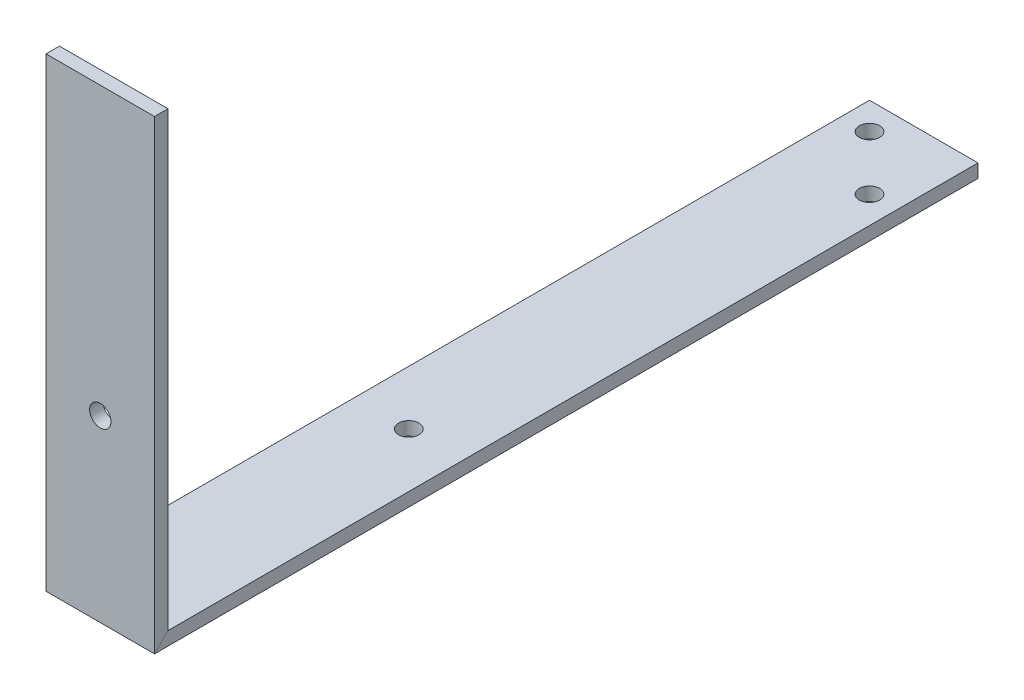
ISO-10303-21;
HEADER;
FILE_DESCRIPTION(('STEP AP214'),'2;1');
FILE_NAME('part.step','',(''),(''),'','','');
FILE_SCHEMA(('AUTOMOTIVE_DESIGN { 1 0 10303 214 1 1 1 1 }'));
ENDSEC;
DATA;
#1=APPLICATION_CONTEXT('core data for automotive mechanical design processes');
#2=APPLICATION_PROTOCOL_DEFINITION('international standard','automotive_design',2000,#1);
#3=PRODUCT_CONTEXT('',#1,'mechanical');
#4=PRODUCT('Part','Part','',(#3));
#5=PRODUCT_RELATED_PRODUCT_CATEGORY('part','',(#4));
#6=PRODUCT_DEFINITION_FORMATION('','',#4);
#7=PRODUCT_DEFINITION_CONTEXT('part definition',#1,'design');
#8=PRODUCT_DEFINITION('design','',#6,#7);
#9=PRODUCT_DEFINITION_SHAPE('','',#8);
#10=(LENGTH_UNIT() NAMED_UNIT(*) SI_UNIT(.MILLI.,.METRE.));
#11=(NAMED_UNIT(*) PLANE_ANGLE_UNIT() SI_UNIT($,.RADIAN.));
#12=(NAMED_UNIT(*) SI_UNIT($,.STERADIAN.) SOLID_ANGLE_UNIT());
#13=UNCERTAINTY_MEASURE_WITH_UNIT(LENGTH_MEASURE(1.E-05),#10,'distance_accuracy_value','');
#14=(GEOMETRIC_REPRESENTATION_CONTEXT(3) GLOBAL_UNCERTAINTY_ASSIGNED_CONTEXT((#13)) GLOBAL_UNIT_ASSIGNED_CONTEXT((#10,
#11,#12)) REPRESENTATION_CONTEXT('',''));
#15=CARTESIAN_POINT('',(0.,0.,0.));
#16=DIRECTION('',(0.,0.,1.));
#17=DIRECTION('',(1.,0.,0.));
#18=AXIS2_PLACEMENT_3D('',#15,#16,#17);
#19=CARTESIAN_POINT('',(1761.3,-570.395,308.16));
#20=DIRECTION('',(0.,1.,0.));
#21=DIRECTION('',(0.,0.,1.));
#22=AXIS2_PLACEMENT_3D('',#19,#20,#21);
#23=PLANE('',#22);
#24=CARTESIAN_POINT('',(1773.99999999906,-570.395,323.462204665884));
#25=DIRECTION('',(0.,-1.,0.));
#26=DIRECTION('',(0.,0.,-1.));
#27=AXIS2_PLACEMENT_3D('',#24,#25,#26);
#28=CIRCLE('',#27,4.76250000000013);
#29=CARTESIAN_POINT('',(1773.99999999906,-570.395,318.699704665884));
#30=VERTEX_POINT('',#29);
#31=EDGE_CURVE('E122',#30,#30,#28,.T.);
#32=ORIENTED_EDGE('',*,*,#31,.F.);
#33=EDGE_LOOP('',(#32));
#34=FACE_BOUND('',#33,.T.);
#35=CARTESIAN_POINT('',(1799.39999999906,-570.395,348.862204665884));
#36=DIRECTION('',(0.,-1.,0.));
#37=DIRECTION('',(0.,0.,-1.));
#38=AXIS2_PLACEMENT_3D('',#35,#36,#37);
#39=CIRCLE('',#38,4.76250000000011);
#40=CARTESIAN_POINT('',(1799.39999999906,-570.395,344.099704665884));
#41=VERTEX_POINT('',#40);
#42=EDGE_CURVE('E125',#41,#41,#39,.T.);
#43=ORIENTED_EDGE('',*,*,#42,.F.);
#44=EDGE_LOOP('',(#43));
#45=FACE_BOUND('',#44,.T.);
#46=CARTESIAN_POINT('',(1786.7,-570.395,551.855));
#47=DIRECTION('',(0.,1.,0.));
#48=DIRECTION('',(0.,0.,1.));
#49=AXIS2_PLACEMENT_3D('',#46,#47,#48);
#50=CIRCLE('',#49,4.76249999999992);
#51=CARTESIAN_POINT('',(1786.7,-570.395,556.6175));
#52=VERTEX_POINT('',#51);
#53=EDGE_CURVE('E138',#52,#52,#50,.T.);
#54=ORIENTED_EDGE('',*,*,#53,.T.);
#55=EDGE_LOOP('',(#54));
#56=FACE_BOUND('',#55,.T.);
#57=DIRECTION('',(-1.,0.,0.));
#58=VECTOR('',#57,1.);
#59=CARTESIAN_POINT('',(1812.1,-570.395,310.76));
#60=LINE('',#59,#58);
#61=CARTESIAN_POINT('',(1812.1,-570.395,310.76));
#62=VERTEX_POINT('',#61);
#63=CARTESIAN_POINT('',(1761.3,-570.395,310.76));
#64=VERTEX_POINT('',#63);
#65=EDGE_CURVE('E52',#62,#64,#60,.T.);
#66=ORIENTED_EDGE('',*,*,#65,.F.);
#67=DIRECTION('',(0.,0.,1.));
#68=VECTOR('',#67,1.);
#69=CARTESIAN_POINT('',(1812.1,-570.395,308.16));
#70=LINE('',#69,#68);
#71=CARTESIAN_POINT('',(1812.1,-570.395,696.315));
#72=VERTEX_POINT('',#71);
#73=EDGE_CURVE('E150',#62,#72,#70,.T.);
#74=ORIENTED_EDGE('',*,*,#73,.T.);
#75=DIRECTION('',(1.,0.,0.));
#76=VECTOR('',#75,1.);
#77=CARTESIAN_POINT('',(1761.3,-570.395,696.315));
#78=LINE('',#77,#76);
#79=CARTESIAN_POINT('',(1761.3,-570.395,696.315));
#80=VERTEX_POINT('',#79);
#81=EDGE_CURVE('E99',#80,#72,#78,.T.);
#82=ORIENTED_EDGE('',*,*,#81,.F.);
#83=DIRECTION('',(0.,0.,1.));
#84=VECTOR('',#83,1.);
#85=CARTESIAN_POINT('',(1761.3,-570.395,308.16));
#86=LINE('',#85,#84);
#87=EDGE_CURVE('E156',#64,#80,#86,.T.);
#88=ORIENTED_EDGE('',*,*,#87,.F.);
#89=EDGE_LOOP('',(#66,#74,#82,#88));
#90=FACE_BOUND('',#89,.T.);
#91=ADVANCED_FACE('F35',(#34,#45,#56,#90),#23,.F.);
#92=CARTESIAN_POINT('',(1812.1,-570.395,308.16));
#93=DIRECTION('',(-1.,0.,0.));
#94=DIRECTION('',(0.,0.,1.));
#95=AXIS2_PLACEMENT_3D('',#92,#93,#94);
#96=PLANE('',#95);
#97=DIRECTION('',(0.,-1.,0.));
#98=VECTOR('',#97,1.);
#99=CARTESIAN_POINT('',(1812.1,-564.085,310.76));
#100=LINE('',#99,#98);
#101=CARTESIAN_POINT('',(1812.1,-564.085,310.76));
#102=VERTEX_POINT('',#101);
#103=EDGE_CURVE('E143',#102,#62,#100,.T.);
#104=ORIENTED_EDGE('',*,*,#103,.F.);
#105=DIRECTION('',(0.,0.,1.));
#106=VECTOR('',#105,1.);
#107=CARTESIAN_POINT('',(1812.1,-564.085,308.16));
#108=LINE('',#107,#106);
#109=CARTESIAN_POINT('',(1812.1,-564.085,690.005));
#110=VERTEX_POINT('',#109);
#111=EDGE_CURVE('E60',#102,#110,#108,.T.);
#112=ORIENTED_EDGE('',*,*,#111,.T.);
#113=DIRECTION('',(0.,0.707106781186548,-0.707106781186548));
#114=VECTOR('',#113,1.);
#115=CARTESIAN_POINT('',(1812.1,-376.3175,502.2375));
#116=LINE('',#115,#114);
#117=EDGE_CURVE('E44',#72,#110,#116,.T.);
#118=ORIENTED_EDGE('',*,*,#117,.F.);
#119=ORIENTED_EDGE('',*,*,#73,.F.);
#120=EDGE_LOOP('',(#104,#112,#118,#119));
#121=FACE_BOUND('',#120,.T.);
#122=ADVANCED_FACE('F185',(#121),#96,.F.);
#123=CARTESIAN_POINT('',(1761.3,-564.085,308.16));
#124=DIRECTION('',(0.,-1.,0.));
#125=DIRECTION('',(0.,0.,-1.));
#126=AXIS2_PLACEMENT_3D('',#123,#124,#125);
#127=PLANE('',#126);
#128=CARTESIAN_POINT('',(1773.99999999906,-564.085,323.462204665884));
#129=DIRECTION('',(0.,-1.,0.));
#130=DIRECTION('',(0.,0.,-1.));
#131=AXIS2_PLACEMENT_3D('',#128,#129,#130);
#132=CIRCLE('',#131,4.76250000000013);
#133=CARTESIAN_POINT('',(1773.99999999906,-564.085,318.699704665884));
#134=VERTEX_POINT('',#133);
#135=EDGE_CURVE('E39',#134,#134,#132,.T.);
#136=ORIENTED_EDGE('',*,*,#135,.T.);
#137=EDGE_LOOP('',(#136));
#138=FACE_BOUND('',#137,.T.);
#139=CARTESIAN_POINT('',(1799.39999999906,-564.085,348.862204665884));
#140=DIRECTION('',(0.,-1.,0.));
#141=DIRECTION('',(0.,0.,-1.));
#142=AXIS2_PLACEMENT_3D('',#139,#140,#141);
#143=CIRCLE('',#142,4.76250000000011);
#144=CARTESIAN_POINT('',(1799.39999999906,-564.085,344.099704665884));
#145=VERTEX_POINT('',#144);
#146=EDGE_CURVE('E128',#145,#145,#143,.T.);
#147=ORIENTED_EDGE('',*,*,#146,.T.);
#148=EDGE_LOOP('',(#147));
#149=FACE_BOUND('',#148,.T.);
#150=CARTESIAN_POINT('',(1786.7,-564.085,551.855));
#151=DIRECTION('',(0.,1.,0.));
#152=DIRECTION('',(0.,0.,1.));
#153=AXIS2_PLACEMENT_3D('',#150,#151,#152);
#154=CIRCLE('',#153,4.76249999999992);
#155=CARTESIAN_POINT('',(1786.7,-564.085,556.6175));
#156=VERTEX_POINT('',#155);
#157=EDGE_CURVE('E135',#156,#156,#154,.T.);
#158=ORIENTED_EDGE('',*,*,#157,.F.);
#159=EDGE_LOOP('',(#158));
#160=FACE_BOUND('',#159,.T.);
#161=DIRECTION('',(1.,0.,0.));
#162=VECTOR('',#161,1.);
#163=CARTESIAN_POINT('',(1761.3,-564.085,310.76));
#164=LINE('',#163,#162);
#165=CARTESIAN_POINT('',(1761.3,-564.085,310.76));
#166=VERTEX_POINT('',#165);
#167=EDGE_CURVE('E141',#166,#102,#164,.T.);
#168=ORIENTED_EDGE('',*,*,#167,.F.);
#169=DIRECTION('',(0.,0.,1.));
#170=VECTOR('',#169,1.);
#171=CARTESIAN_POINT('',(1761.3,-564.085,308.16));
#172=LINE('',#171,#170);
#173=CARTESIAN_POINT('',(1761.3,-564.085,690.005));
#174=VERTEX_POINT('',#173);
#175=EDGE_CURVE('E154',#166,#174,#172,.T.);
#176=ORIENTED_EDGE('',*,*,#175,.T.);
#177=DIRECTION('',(-1.,0.,0.));
#178=VECTOR('',#177,1.);
#179=CARTESIAN_POINT('',(1761.3,-564.085,690.005));
#180=LINE('',#179,#178);
#181=EDGE_CURVE('E11',#110,#174,#180,.T.);
#182=ORIENTED_EDGE('',*,*,#181,.F.);
#183=ORIENTED_EDGE('',*,*,#111,.F.);
#184=EDGE_LOOP('',(#168,#176,#182,#183));
#185=FACE_BOUND('',#184,.T.);
#186=ADVANCED_FACE('F166',(#138,#149,#160,#185),#127,.F.);
#187=CARTESIAN_POINT('',(1761.3,-570.395,308.16));
#188=DIRECTION('',(1.,0.,0.));
#189=DIRECTION('',(0.,0.,-1.));
#190=AXIS2_PLACEMENT_3D('',#187,#188,#189);
#191=PLANE('',#190);
#192=DIRECTION('',(0.,1.,0.));
#193=VECTOR('',#192,1.);
#194=CARTESIAN_POINT('',(1761.3,-570.395,310.76));
#195=LINE('',#194,#193);
#196=EDGE_CURVE('E103',#64,#166,#195,.T.);
#197=ORIENTED_EDGE('',*,*,#196,.F.);
#198=ORIENTED_EDGE('',*,*,#87,.T.);
#199=DIRECTION('',(0.,-0.707106781186548,0.707106781186548));
#200=VECTOR('',#199,1.);
#201=CARTESIAN_POINT('',(1761.3,-376.3175,502.2375));
#202=LINE('',#201,#200);
#203=EDGE_CURVE('E149',#174,#80,#202,.T.);
#204=ORIENTED_EDGE('',*,*,#203,.F.);
#205=ORIENTED_EDGE('',*,*,#175,.F.);
#206=EDGE_LOOP('',(#197,#198,#204,#205));
#207=FACE_BOUND('',#206,.T.);
#208=ADVANCED_FACE('F208',(#207),#191,.F.);
#209=CARTESIAN_POINT('',(1761.3,-570.8105,696.315));
#210=DIRECTION('',(0.,0.,-1.));
#211=DIRECTION('',(-1.,0.,0.));
#212=AXIS2_PLACEMENT_3D('',#209,#210,#211);
#213=PLANE('',#212);
#214=CARTESIAN_POINT('',(1786.70000007806,-486.498712740003,696.315));
#215=DIRECTION('',(0.,0.,-1.));
#216=DIRECTION('',(-1.,0.,0.));
#217=AXIS2_PLACEMENT_3D('',#214,#215,#216);
#218=CIRCLE('',#217,5.00000002243565);
#219=CARTESIAN_POINT('',(1781.70000005563,-486.498712740003,696.315));
#220=VERTEX_POINT('',#219);
#221=EDGE_CURVE('E132',#220,#220,#218,.T.);
#222=ORIENTED_EDGE('',*,*,#221,.T.);
#223=EDGE_LOOP('',(#222));
#224=FACE_BOUND('',#223,.T.);
#225=DIRECTION('',(0.,1.,0.));
#226=VECTOR('',#225,1.);
#227=CARTESIAN_POINT('',(1812.1,-570.8105,696.315));
#228=LINE('',#227,#226);
#229=CARTESIAN_POINT('',(1812.1,-352.495,696.315));
#230=VERTEX_POINT('',#229);
#231=EDGE_CURVE('E93',#72,#230,#228,.T.);
#232=ORIENTED_EDGE('',*,*,#231,.T.);
#233=DIRECTION('',(1.,0.,0.));
#234=VECTOR('',#233,1.);
#235=CARTESIAN_POINT('',(1812.1,-352.495,696.315));
#236=LINE('',#235,#234);
#237=CARTESIAN_POINT('',(1761.3,-352.495,696.315));
#238=VERTEX_POINT('',#237);
#239=EDGE_CURVE('E97',#238,#230,#236,.T.);
#240=ORIENTED_EDGE('',*,*,#239,.F.);
#241=DIRECTION('',(0.,1.,0.));
#242=VECTOR('',#241,1.);
#243=CARTESIAN_POINT('',(1761.3,-570.8105,696.315));
#244=LINE('',#243,#242);
#245=EDGE_CURVE('E152',#80,#238,#244,.T.);
#246=ORIENTED_EDGE('',*,*,#245,.F.);
#247=ORIENTED_EDGE('',*,*,#81,.T.);
#248=EDGE_LOOP('',(#232,#240,#246,#247));
#249=FACE_BOUND('',#248,.T.);
#250=ADVANCED_FACE('F37',(#224,#249),#213,.F.);
#251=CARTESIAN_POINT('',(1812.1,-570.8105,696.315));
#252=DIRECTION('',(-1.,0.,0.));
#253=DIRECTION('',(0.,0.,1.));
#254=AXIS2_PLACEMENT_3D('',#251,#252,#253);
#255=PLANE('',#254);
#256=DIRECTION('',(0.,1.,0.));
#257=VECTOR('',#256,1.);
#258=CARTESIAN_POINT('',(1812.1,-570.8105,690.005));
#259=LINE('',#258,#257);
#260=CARTESIAN_POINT('',(1812.1,-352.495,690.005));
#261=VERTEX_POINT('',#260);
#262=EDGE_CURVE('E102',#110,#261,#259,.T.);
#263=ORIENTED_EDGE('',*,*,#262,.T.);
#264=DIRECTION('',(0.,0.,-1.));
#265=VECTOR('',#264,1.);
#266=CARTESIAN_POINT('',(1812.1,-352.495,690.005));
#267=LINE('',#266,#265);
#268=EDGE_CURVE('E106',#230,#261,#267,.T.);
#269=ORIENTED_EDGE('',*,*,#268,.F.);
#270=ORIENTED_EDGE('',*,*,#231,.F.);
#271=ORIENTED_EDGE('',*,*,#117,.T.);
#272=EDGE_LOOP('',(#263,#269,#270,#271));
#273=FACE_BOUND('',#272,.T.);
#274=ADVANCED_FACE('F107',(#273),#255,.F.);
#275=CARTESIAN_POINT('',(1761.3,-570.8105,690.005));
#276=DIRECTION('',(0.,0.,1.));
#277=DIRECTION('',(1.,0.,0.));
#278=AXIS2_PLACEMENT_3D('',#275,#276,#277);
#279=PLANE('',#278);
#280=CARTESIAN_POINT('',(1786.70000007806,-486.498712740003,690.005));
#281=DIRECTION('',(0.,0.,-1.));
#282=DIRECTION('',(-1.,0.,0.));
#283=AXIS2_PLACEMENT_3D('',#280,#281,#282);
#284=CIRCLE('',#283,5.00000002243565);
#285=CARTESIAN_POINT('',(1781.70000005563,-486.498712740003,690.005));
#286=VERTEX_POINT('',#285);
#287=EDGE_CURVE('E129',#286,#286,#284,.T.);
#288=ORIENTED_EDGE('',*,*,#287,.F.);
#289=EDGE_LOOP('',(#288));
#290=FACE_BOUND('',#289,.T.);
#291=DIRECTION('',(0.,1.,0.));
#292=VECTOR('',#291,1.);
#293=CARTESIAN_POINT('',(1761.3,-570.8105,690.005));
#294=LINE('',#293,#292);
#295=CARTESIAN_POINT('',(1761.3,-352.495,690.005));
#296=VERTEX_POINT('',#295);
#297=EDGE_CURVE('E161',#174,#296,#294,.T.);
#298=ORIENTED_EDGE('',*,*,#297,.T.);
#299=DIRECTION('',(-1.,0.,0.));
#300=VECTOR('',#299,1.);
#301=CARTESIAN_POINT('',(1761.3,-352.495,690.005));
#302=LINE('',#301,#300);
#303=EDGE_CURVE('E112',#261,#296,#302,.T.);
#304=ORIENTED_EDGE('',*,*,#303,.F.);
#305=ORIENTED_EDGE('',*,*,#262,.F.);
#306=ORIENTED_EDGE('',*,*,#181,.T.);
#307=EDGE_LOOP('',(#298,#304,#305,#306));
#308=FACE_BOUND('',#307,.T.);
#309=ADVANCED_FACE('F200',(#290,#308),#279,.F.);
#310=CARTESIAN_POINT('',(1761.3,-570.8105,696.315));
#311=DIRECTION('',(1.,0.,0.));
#312=DIRECTION('',(0.,0.,-1.));
#313=AXIS2_PLACEMENT_3D('',#310,#311,#312);
#314=PLANE('',#313);
#315=ORIENTED_EDGE('',*,*,#245,.T.);
#316=DIRECTION('',(0.,0.,1.));
#317=VECTOR('',#316,1.);
#318=CARTESIAN_POINT('',(1761.3,-352.495,696.315));
#319=LINE('',#318,#317);
#320=EDGE_CURVE('E117',#296,#238,#319,.T.);
#321=ORIENTED_EDGE('',*,*,#320,.F.);
#322=ORIENTED_EDGE('',*,*,#297,.F.);
#323=ORIENTED_EDGE('',*,*,#203,.T.);
#324=EDGE_LOOP('',(#315,#321,#322,#323));
#325=FACE_BOUND('',#324,.T.);
#326=ADVANCED_FACE('F196',(#325),#314,.F.);
#327=CARTESIAN_POINT('',(0.,0.,310.76));
#328=DIRECTION('',(0.,0.,-1.));
#329=DIRECTION('',(-1.,0.,0.));
#330=AXIS2_PLACEMENT_3D('',#327,#328,#329);
#331=PLANE('',#330);
#332=ORIENTED_EDGE('',*,*,#167,.T.);
#333=ORIENTED_EDGE('',*,*,#103,.T.);
#334=ORIENTED_EDGE('',*,*,#65,.T.);
#335=ORIENTED_EDGE('',*,*,#196,.T.);
#336=EDGE_LOOP('',(#332,#333,#334,#335));
#337=FACE_BOUND('',#336,.T.);
#338=ADVANCED_FACE('F199',(#337),#331,.T.);
#339=CARTESIAN_POINT('',(1786.7,-597.085,551.855));
#340=DIRECTION('',(0.,1.,0.));
#341=DIRECTION('',(0.,0.,1.));
#342=AXIS2_PLACEMENT_3D('',#339,#340,#341);
#343=CYLINDRICAL_SURFACE('',#342,4.76249999999992);
#344=ORIENTED_EDGE('',*,*,#157,.T.);
#345=EDGE_LOOP('',(#344));
#346=FACE_BOUND('',#345,.T.);
#347=ORIENTED_EDGE('',*,*,#53,.F.);
#348=EDGE_LOOP('',(#347));
#349=FACE_BOUND('',#348,.T.);
#350=ADVANCED_FACE('F181',(#346,#349),#343,.F.);
#351=CARTESIAN_POINT('',(1786.70000007806,-486.498712740003,723.005));
#352=DIRECTION('',(0.,0.,-1.));
#353=DIRECTION('',(-1.,0.,0.));
#354=AXIS2_PLACEMENT_3D('',#351,#352,#353);
#355=CYLINDRICAL_SURFACE('',#354,5.00000002243565);
#356=ORIENTED_EDGE('',*,*,#287,.T.);
#357=EDGE_LOOP('',(#356));
#358=FACE_BOUND('',#357,.T.);
#359=ORIENTED_EDGE('',*,*,#221,.F.);
#360=EDGE_LOOP('',(#359));
#361=FACE_BOUND('',#360,.T.);
#362=ADVANCED_FACE('F172',(#358,#361),#355,.F.);
#363=CARTESIAN_POINT('',(1799.39999999906,-520.395,348.862204665884));
#364=DIRECTION('',(0.,-1.,0.));
#365=DIRECTION('',(0.,0.,-1.));
#366=AXIS2_PLACEMENT_3D('',#363,#364,#365);
#367=CYLINDRICAL_SURFACE('',#366,4.76250000000011);
#368=ORIENTED_EDGE('',*,*,#42,.T.);
#369=EDGE_LOOP('',(#368));
#370=FACE_BOUND('',#369,.T.);
#371=ORIENTED_EDGE('',*,*,#146,.F.);
#372=EDGE_LOOP('',(#371));
#373=FACE_BOUND('',#372,.T.);
#374=ADVANCED_FACE('F169',(#370,#373),#367,.F.);
#375=CARTESIAN_POINT('',(1773.99999999906,-520.395,323.462204665884));
#376=DIRECTION('',(0.,-1.,0.));
#377=DIRECTION('',(0.,0.,-1.));
#378=AXIS2_PLACEMENT_3D('',#375,#376,#377);
#379=CYLINDRICAL_SURFACE('',#378,4.76250000000013);
#380=ORIENTED_EDGE('',*,*,#31,.T.);
#381=EDGE_LOOP('',(#380));
#382=FACE_BOUND('',#381,.T.);
#383=ORIENTED_EDGE('',*,*,#135,.F.);
#384=EDGE_LOOP('',(#383));
#385=FACE_BOUND('',#384,.T.);
#386=ADVANCED_FACE('F171',(#382,#385),#379,.F.);
#387=CARTESIAN_POINT('',(0.,-352.495,0.));
#388=DIRECTION('',(0.,-1.,0.));
#389=DIRECTION('',(0.,0.,-1.));
#390=AXIS2_PLACEMENT_3D('',#387,#388,#389);
#391=PLANE('',#390);
#392=ORIENTED_EDGE('',*,*,#239,.T.);
#393=ORIENTED_EDGE('',*,*,#268,.T.);
#394=ORIENTED_EDGE('',*,*,#303,.T.);
#395=ORIENTED_EDGE('',*,*,#320,.T.);
#396=EDGE_LOOP('',(#392,#393,#394,#395));
#397=FACE_BOUND('',#396,.T.);
#398=ADVANCED_FACE('F115',(#397),#391,.F.);
#399=CLOSED_SHELL('',(#91,#122,#186,#208,#250,#274,#309,#326,#338,#350,#362,#374,#386,#398));
#400=MANIFOLD_SOLID_BREP('B2',#399);
#401=ADVANCED_BREP_SHAPE_REPRESENTATION('',(#18,#400),#14);
#402=SHAPE_DEFINITION_REPRESENTATION(#9,#401);
ENDSEC;
END-ISO-10303-21;
